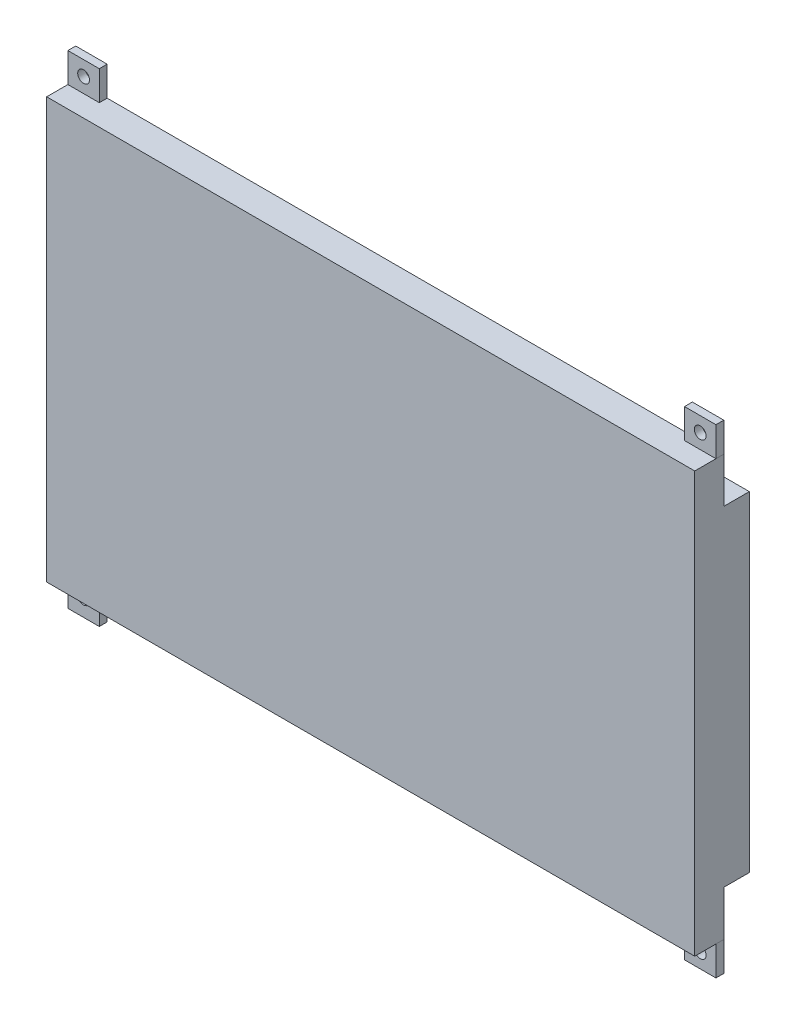
ISO-10303-21;
HEADER;
FILE_DESCRIPTION(('STEP AP214'),'2;1');
FILE_NAME('part.step','',(''),(''),'','','');
FILE_SCHEMA(('AUTOMOTIVE_DESIGN { 1 0 10303 214 1 1 1 1 }'));
ENDSEC;
DATA;
#1=APPLICATION_CONTEXT('core data for automotive mechanical design processes');
#2=APPLICATION_PROTOCOL_DEFINITION('international standard','automotive_design',2000,#1);
#3=PRODUCT_CONTEXT('',#1,'mechanical');
#4=PRODUCT('Part','Part','',(#3));
#5=PRODUCT_RELATED_PRODUCT_CATEGORY('part','',(#4));
#6=PRODUCT_DEFINITION_FORMATION('','',#4);
#7=PRODUCT_DEFINITION_CONTEXT('part definition',#1,'design');
#8=PRODUCT_DEFINITION('design','',#6,#7);
#9=PRODUCT_DEFINITION_SHAPE('','',#8);
#10=(LENGTH_UNIT() NAMED_UNIT(*) SI_UNIT(.MILLI.,.METRE.));
#11=(NAMED_UNIT(*) PLANE_ANGLE_UNIT() SI_UNIT($,.RADIAN.));
#12=(NAMED_UNIT(*) SI_UNIT($,.STERADIAN.) SOLID_ANGLE_UNIT());
#13=UNCERTAINTY_MEASURE_WITH_UNIT(LENGTH_MEASURE(1.E-05),#10,'distance_accuracy_value','');
#14=(GEOMETRIC_REPRESENTATION_CONTEXT(3) GLOBAL_UNCERTAINTY_ASSIGNED_CONTEXT((#13)) GLOBAL_UNIT_ASSIGNED_CONTEXT((#10,
#11,#12)) REPRESENTATION_CONTEXT('',''));
#15=CARTESIAN_POINT('',(0.,0.,0.));
#16=DIRECTION('',(0.,0.,1.));
#17=DIRECTION('',(1.,0.,0.));
#18=AXIS2_PLACEMENT_3D('',#15,#16,#17);
#19=CARTESIAN_POINT('',(82.5,-53.5,2.));
#20=DIRECTION('',(1.,0.,0.));
#21=DIRECTION('',(0.,0.,-1.));
#22=AXIS2_PLACEMENT_3D('',#19,#20,#21);
#23=PLANE('',#22);
#24=DIRECTION('',(0.,-1.,0.));
#25=VECTOR('',#24,1.);
#26=CARTESIAN_POINT('',(82.5,-53.5,0.));
#27=LINE('',#26,#25);
#28=CARTESIAN_POINT('',(82.5,-53.5,0.));
#29=VERTEX_POINT('',#28);
#30=CARTESIAN_POINT('',(82.5,-61.,0.));
#31=VERTEX_POINT('',#30);
#32=EDGE_CURVE('E109',#29,#31,#27,.T.);
#33=ORIENTED_EDGE('',*,*,#32,.F.);
#34=DIRECTION('',(0.,0.,-1.));
#35=VECTOR('',#34,1.);
#36=CARTESIAN_POINT('',(82.5,-53.5,2.));
#37=LINE('',#36,#35);
#38=CARTESIAN_POINT('',(82.5,-53.5,2.));
#39=VERTEX_POINT('',#38);
#40=EDGE_CURVE('E12',#39,#29,#37,.T.);
#41=ORIENTED_EDGE('',*,*,#40,.F.);
#42=DIRECTION('',(0.,-1.,0.));
#43=VECTOR('',#42,1.);
#44=CARTESIAN_POINT('',(82.5,-53.5,2.));
#45=LINE('',#44,#43);
#46=CARTESIAN_POINT('',(82.5,-61.,2.));
#47=VERTEX_POINT('',#46);
#48=EDGE_CURVE('E102',#39,#47,#45,.T.);
#49=ORIENTED_EDGE('',*,*,#48,.T.);
#50=DIRECTION('',(0.,0.,-1.));
#51=VECTOR('',#50,1.);
#52=CARTESIAN_POINT('',(82.5,-61.,2.));
#53=LINE('',#52,#51);
#54=EDGE_CURVE('E47',#47,#31,#53,.T.);
#55=ORIENTED_EDGE('',*,*,#54,.T.);
#56=EDGE_LOOP('',(#33,#41,#49,#55));
#57=FACE_BOUND('',#56,.T.);
#58=ADVANCED_FACE('F44',(#57),#23,.T.);
#59=CARTESIAN_POINT('',(82.5,-53.5,2.));
#60=DIRECTION('',(0.,1.,0.));
#61=DIRECTION('',(-1.,0.,0.));
#62=AXIS2_PLACEMENT_3D('',#59,#60,#61);
#63=PLANE('',#62);
#64=DIRECTION('',(1.,0.,0.));
#65=VECTOR('',#64,1.);
#66=CARTESIAN_POINT('',(82.5,-53.5,0.));
#67=LINE('',#66,#65);
#68=CARTESIAN_POINT('',(74.5,-53.5,0.));
#69=VERTEX_POINT('',#68);
#70=EDGE_CURVE('E104',#69,#29,#67,.T.);
#71=ORIENTED_EDGE('',*,*,#70,.F.);
#72=DIRECTION('',(0.,0.,-1.));
#73=VECTOR('',#72,1.);
#74=CARTESIAN_POINT('',(74.5,-53.5,2.));
#75=LINE('',#74,#73);
#76=CARTESIAN_POINT('',(74.5,-53.5,2.));
#77=VERTEX_POINT('',#76);
#78=EDGE_CURVE('E53',#77,#69,#75,.T.);
#79=ORIENTED_EDGE('',*,*,#78,.F.);
#80=DIRECTION('',(1.,0.,0.));
#81=VECTOR('',#80,1.);
#82=CARTESIAN_POINT('',(82.5,-53.5,2.));
#83=LINE('',#82,#81);
#84=EDGE_CURVE('E99',#77,#39,#83,.T.);
#85=ORIENTED_EDGE('',*,*,#84,.T.);
#86=ORIENTED_EDGE('',*,*,#40,.T.);
#87=EDGE_LOOP('',(#71,#79,#85,#86));
#88=FACE_BOUND('',#87,.T.);
#89=ADVANCED_FACE('F120',(#88),#63,.T.);
#90=CARTESIAN_POINT('',(74.5,-53.5,2.));
#91=DIRECTION('',(-1.,0.,0.));
#92=DIRECTION('',(0.,-1.,0.));
#93=AXIS2_PLACEMENT_3D('',#90,#91,#92);
#94=PLANE('',#93);
#95=DIRECTION('',(0.,1.,0.));
#96=VECTOR('',#95,1.);
#97=CARTESIAN_POINT('',(74.5,-53.5,0.));
#98=LINE('',#97,#96);
#99=CARTESIAN_POINT('',(74.5,-61.,0.));
#100=VERTEX_POINT('',#99);
#101=EDGE_CURVE('E94',#100,#69,#98,.T.);
#102=ORIENTED_EDGE('',*,*,#101,.F.);
#103=DIRECTION('',(0.,0.,-1.));
#104=VECTOR('',#103,1.);
#105=CARTESIAN_POINT('',(74.5,-61.,2.));
#106=LINE('',#105,#104);
#107=CARTESIAN_POINT('',(74.5,-61.,2.));
#108=VERTEX_POINT('',#107);
#109=EDGE_CURVE('E89',#108,#100,#106,.T.);
#110=ORIENTED_EDGE('',*,*,#109,.F.);
#111=DIRECTION('',(0.,1.,0.));
#112=VECTOR('',#111,1.);
#113=CARTESIAN_POINT('',(74.5,-53.5,2.));
#114=LINE('',#113,#112);
#115=EDGE_CURVE('E92',#108,#77,#114,.T.);
#116=ORIENTED_EDGE('',*,*,#115,.T.);
#117=ORIENTED_EDGE('',*,*,#78,.T.);
#118=EDGE_LOOP('',(#102,#110,#116,#117));
#119=FACE_BOUND('',#118,.T.);
#120=ADVANCED_FACE('F91',(#119),#94,.T.);
#121=CARTESIAN_POINT('',(82.5,-61.,2.));
#122=DIRECTION('',(0.,-1.,0.));
#123=DIRECTION('',(0.,0.,-1.));
#124=AXIS2_PLACEMENT_3D('',#121,#122,#123);
#125=PLANE('',#124);
#126=DIRECTION('',(-1.,0.,0.));
#127=VECTOR('',#126,1.);
#128=CARTESIAN_POINT('',(82.5,-61.,0.));
#129=LINE('',#128,#127);
#130=EDGE_CURVE('E112',#31,#100,#129,.T.);
#131=ORIENTED_EDGE('',*,*,#130,.F.);
#132=ORIENTED_EDGE('',*,*,#54,.F.);
#133=DIRECTION('',(-1.,0.,0.));
#134=VECTOR('',#133,1.);
#135=CARTESIAN_POINT('',(82.5,-61.,2.));
#136=LINE('',#135,#134);
#137=EDGE_CURVE('E98',#47,#108,#136,.T.);
#138=ORIENTED_EDGE('',*,*,#137,.T.);
#139=ORIENTED_EDGE('',*,*,#109,.T.);
#140=EDGE_LOOP('',(#131,#132,#138,#139));
#141=FACE_BOUND('',#140,.T.);
#142=ADVANCED_FACE('F101',(#141),#125,.T.);
#143=CARTESIAN_POINT('',(0.,0.,2.));
#144=DIRECTION('',(0.,0.,-1.));
#145=DIRECTION('',(-1.,0.,0.));
#146=AXIS2_PLACEMENT_3D('',#143,#144,#145);
#147=PLANE('',#146);
#148=CARTESIAN_POINT('',(78.5,-57.25,2.));
#149=DIRECTION('',(0.,0.,-1.));
#150=DIRECTION('',(-1.,0.,0.));
#151=AXIS2_PLACEMENT_3D('',#148,#149,#150);
#152=CIRCLE('',#151,1.5);
#153=CARTESIAN_POINT('',(77.,-57.25,2.));
#154=VERTEX_POINT('',#153);
#155=EDGE_CURVE('E113',#154,#154,#152,.T.);
#156=ORIENTED_EDGE('',*,*,#155,.T.);
#157=EDGE_LOOP('',(#156));
#158=FACE_BOUND('',#157,.T.);
#159=ORIENTED_EDGE('',*,*,#48,.F.);
#160=ORIENTED_EDGE('',*,*,#84,.F.);
#161=ORIENTED_EDGE('',*,*,#115,.F.);
#162=ORIENTED_EDGE('',*,*,#137,.F.);
#163=EDGE_LOOP('',(#159,#160,#161,#162));
#164=FACE_BOUND('',#163,.T.);
#165=ADVANCED_FACE('F97',(#158,#164),#147,.F.);
#166=CARTESIAN_POINT('',(0.,0.,0.));
#167=DIRECTION('',(0.,0.,-1.));
#168=DIRECTION('',(-1.,0.,0.));
#169=AXIS2_PLACEMENT_3D('',#166,#167,#168);
#170=PLANE('',#169);
#171=CARTESIAN_POINT('',(78.5,-57.25,0.));
#172=DIRECTION('',(0.,0.,-1.));
#173=DIRECTION('',(-1.,0.,0.));
#174=AXIS2_PLACEMENT_3D('',#171,#172,#173);
#175=CIRCLE('',#174,1.5);
#176=CARTESIAN_POINT('',(77.,-57.25,0.));
#177=VERTEX_POINT('',#176);
#178=EDGE_CURVE('E150',#177,#177,#175,.T.);
#179=ORIENTED_EDGE('',*,*,#178,.F.);
#180=EDGE_LOOP('',(#179));
#181=FACE_BOUND('',#180,.T.);
#182=ORIENTED_EDGE('',*,*,#32,.T.);
#183=ORIENTED_EDGE('',*,*,#130,.T.);
#184=ORIENTED_EDGE('',*,*,#101,.T.);
#185=ORIENTED_EDGE('',*,*,#70,.T.);
#186=EDGE_LOOP('',(#182,#183,#184,#185));
#187=FACE_BOUND('',#186,.T.);
#188=ADVANCED_FACE('F119',(#181,#187),#170,.T.);
#189=CARTESIAN_POINT('',(78.5,-57.25,2.));
#190=DIRECTION('',(0.,0.,-1.));
#191=DIRECTION('',(-1.,0.,0.));
#192=AXIS2_PLACEMENT_3D('',#189,#190,#191);
#193=CYLINDRICAL_SURFACE('',#192,1.5);
#194=ORIENTED_EDGE('',*,*,#155,.F.);
#195=EDGE_LOOP('',(#194));
#196=FACE_BOUND('',#195,.T.);
#197=ORIENTED_EDGE('',*,*,#178,.T.);
#198=EDGE_LOOP('',(#197));
#199=FACE_BOUND('',#198,.T.);
#200=ADVANCED_FACE('F138',(#196,#199),#193,.F.);
#201=CLOSED_SHELL('',(#58,#89,#120,#142,#165,#188,#200));
#202=MANIFOLD_SOLID_BREP('B2',#201);
#203=CARTESIAN_POINT('',(-82.5,-53.5,2.));
#204=DIRECTION('',(-1.,0.,0.));
#205=DIRECTION('',(0.,0.,1.));
#206=AXIS2_PLACEMENT_3D('',#203,#204,#205);
#207=PLANE('',#206);
#208=DIRECTION('',(0.,1.,0.));
#209=VECTOR('',#208,1.);
#210=CARTESIAN_POINT('',(-82.5,-53.5,0.));
#211=LINE('',#210,#209);
#212=CARTESIAN_POINT('',(-82.5,-62.,0.));
#213=VERTEX_POINT('',#212);
#214=CARTESIAN_POINT('',(-82.5,-53.5,0.));
#215=VERTEX_POINT('',#214);
#216=EDGE_CURVE('E264',#213,#215,#211,.T.);
#217=ORIENTED_EDGE('',*,*,#216,.F.);
#218=DIRECTION('',(0.,0.,-1.));
#219=VECTOR('',#218,1.);
#220=CARTESIAN_POINT('',(-82.5,-62.,2.));
#221=LINE('',#220,#219);
#222=CARTESIAN_POINT('',(-82.5,-62.,2.));
#223=VERTEX_POINT('',#222);
#224=EDGE_CURVE('E42',#223,#213,#221,.T.);
#225=ORIENTED_EDGE('',*,*,#224,.F.);
#226=DIRECTION('',(0.,1.,0.));
#227=VECTOR('',#226,1.);
#228=CARTESIAN_POINT('',(-82.5,-53.5,2.));
#229=LINE('',#228,#227);
#230=CARTESIAN_POINT('',(-82.5,-53.5,2.));
#231=VERTEX_POINT('',#230);
#232=EDGE_CURVE('E257',#223,#231,#229,.T.);
#233=ORIENTED_EDGE('',*,*,#232,.T.);
#234=DIRECTION('',(0.,0.,-1.));
#235=VECTOR('',#234,1.);
#236=CARTESIAN_POINT('',(-82.5,-53.5,2.));
#237=LINE('',#236,#235);
#238=EDGE_CURVE('E202',#231,#215,#237,.T.);
#239=ORIENTED_EDGE('',*,*,#238,.T.);
#240=EDGE_LOOP('',(#217,#225,#233,#239));
#241=FACE_BOUND('',#240,.T.);
#242=ADVANCED_FACE('F199',(#241),#207,.T.);
#243=CARTESIAN_POINT('',(-82.5,-62.,2.));
#244=DIRECTION('',(0.,-1.,0.));
#245=DIRECTION('',(0.,0.,-1.));
#246=AXIS2_PLACEMENT_3D('',#243,#244,#245);
#247=PLANE('',#246);
#248=DIRECTION('',(-1.,0.,0.));
#249=VECTOR('',#248,1.);
#250=CARTESIAN_POINT('',(-82.5,-62.,0.));
#251=LINE('',#250,#249);
#252=CARTESIAN_POINT('',(-74.5,-62.,0.));
#253=VERTEX_POINT('',#252);
#254=EDGE_CURVE('E259',#253,#213,#251,.T.);
#255=ORIENTED_EDGE('',*,*,#254,.F.);
#256=DIRECTION('',(0.,0.,-1.));
#257=VECTOR('',#256,1.);
#258=CARTESIAN_POINT('',(-74.5,-62.,2.));
#259=LINE('',#258,#257);
#260=CARTESIAN_POINT('',(-74.5,-62.,2.));
#261=VERTEX_POINT('',#260);
#262=EDGE_CURVE('E208',#261,#253,#259,.T.);
#263=ORIENTED_EDGE('',*,*,#262,.F.);
#264=DIRECTION('',(-1.,0.,0.));
#265=VECTOR('',#264,1.);
#266=CARTESIAN_POINT('',(-82.5,-62.,2.));
#267=LINE('',#266,#265);
#268=EDGE_CURVE('E254',#261,#223,#267,.T.);
#269=ORIENTED_EDGE('',*,*,#268,.T.);
#270=ORIENTED_EDGE('',*,*,#224,.T.);
#271=EDGE_LOOP('',(#255,#263,#269,#270));
#272=FACE_BOUND('',#271,.T.);
#273=ADVANCED_FACE('F275',(#272),#247,.T.);
#274=CARTESIAN_POINT('',(-74.5,-53.5,2.));
#275=DIRECTION('',(1.,0.,0.));
#276=DIRECTION('',(0.,0.,-1.));
#277=AXIS2_PLACEMENT_3D('',#274,#275,#276);
#278=PLANE('',#277);
#279=DIRECTION('',(0.,-1.,0.));
#280=VECTOR('',#279,1.);
#281=CARTESIAN_POINT('',(-74.5,-53.5,0.));
#282=LINE('',#281,#280);
#283=CARTESIAN_POINT('',(-74.5,-53.5,0.));
#284=VERTEX_POINT('',#283);
#285=EDGE_CURVE('E249',#284,#253,#282,.T.);
#286=ORIENTED_EDGE('',*,*,#285,.F.);
#287=DIRECTION('',(0.,0.,-1.));
#288=VECTOR('',#287,1.);
#289=CARTESIAN_POINT('',(-74.5,-53.5,2.));
#290=LINE('',#289,#288);
#291=CARTESIAN_POINT('',(-74.5,-53.5,2.));
#292=VERTEX_POINT('',#291);
#293=EDGE_CURVE('E244',#292,#284,#290,.T.);
#294=ORIENTED_EDGE('',*,*,#293,.F.);
#295=DIRECTION('',(0.,-1.,0.));
#296=VECTOR('',#295,1.);
#297=CARTESIAN_POINT('',(-74.5,-53.5,2.));
#298=LINE('',#297,#296);
#299=EDGE_CURVE('E247',#292,#261,#298,.T.);
#300=ORIENTED_EDGE('',*,*,#299,.T.);
#301=ORIENTED_EDGE('',*,*,#262,.T.);
#302=EDGE_LOOP('',(#286,#294,#300,#301));
#303=FACE_BOUND('',#302,.T.);
#304=ADVANCED_FACE('F246',(#303),#278,.T.);
#305=CARTESIAN_POINT('',(-82.5,-53.5,2.));
#306=DIRECTION('',(0.,1.,0.));
#307=DIRECTION('',(0.,0.,1.));
#308=AXIS2_PLACEMENT_3D('',#305,#306,#307);
#309=PLANE('',#308);
#310=DIRECTION('',(1.,0.,0.));
#311=VECTOR('',#310,1.);
#312=CARTESIAN_POINT('',(-82.5,-53.5,0.));
#313=LINE('',#312,#311);
#314=EDGE_CURVE('E267',#215,#284,#313,.T.);
#315=ORIENTED_EDGE('',*,*,#314,.F.);
#316=ORIENTED_EDGE('',*,*,#238,.F.);
#317=DIRECTION('',(1.,0.,0.));
#318=VECTOR('',#317,1.);
#319=CARTESIAN_POINT('',(-82.5,-53.5,2.));
#320=LINE('',#319,#318);
#321=EDGE_CURVE('E253',#231,#292,#320,.T.);
#322=ORIENTED_EDGE('',*,*,#321,.T.);
#323=ORIENTED_EDGE('',*,*,#293,.T.);
#324=EDGE_LOOP('',(#315,#316,#322,#323));
#325=FACE_BOUND('',#324,.T.);
#326=ADVANCED_FACE('F256',(#325),#309,.T.);
#327=CARTESIAN_POINT('',(0.,0.,2.));
#328=DIRECTION('',(0.,0.,1.));
#329=DIRECTION('',(1.,0.,0.));
#330=AXIS2_PLACEMENT_3D('',#327,#328,#329);
#331=PLANE('',#330);
#332=CARTESIAN_POINT('',(-78.5,-57.75,2.));
#333=DIRECTION('',(0.,0.,-1.));
#334=DIRECTION('',(-1.,0.,0.));
#335=AXIS2_PLACEMENT_3D('',#332,#333,#334);
#336=CIRCLE('',#335,1.5);
#337=CARTESIAN_POINT('',(-80.,-57.75,2.));
#338=VERTEX_POINT('',#337);
#339=EDGE_CURVE('E268',#338,#338,#336,.T.);
#340=ORIENTED_EDGE('',*,*,#339,.T.);
#341=EDGE_LOOP('',(#340));
#342=FACE_BOUND('',#341,.T.);
#343=ORIENTED_EDGE('',*,*,#232,.F.);
#344=ORIENTED_EDGE('',*,*,#268,.F.);
#345=ORIENTED_EDGE('',*,*,#299,.F.);
#346=ORIENTED_EDGE('',*,*,#321,.F.);
#347=EDGE_LOOP('',(#343,#344,#345,#346));
#348=FACE_BOUND('',#347,.T.);
#349=ADVANCED_FACE('F252',(#342,#348),#331,.T.);
#350=CARTESIAN_POINT('',(0.,0.,0.));
#351=DIRECTION('',(0.,0.,1.));
#352=DIRECTION('',(1.,0.,0.));
#353=AXIS2_PLACEMENT_3D('',#350,#351,#352);
#354=PLANE('',#353);
#355=CARTESIAN_POINT('',(-78.5,-57.75,0.));
#356=DIRECTION('',(0.,0.,-1.));
#357=DIRECTION('',(-1.,0.,0.));
#358=AXIS2_PLACEMENT_3D('',#355,#356,#357);
#359=CIRCLE('',#358,1.5);
#360=CARTESIAN_POINT('',(-80.,-57.75,0.));
#361=VERTEX_POINT('',#360);
#362=EDGE_CURVE('E305',#361,#361,#359,.T.);
#363=ORIENTED_EDGE('',*,*,#362,.F.);
#364=EDGE_LOOP('',(#363));
#365=FACE_BOUND('',#364,.T.);
#366=ORIENTED_EDGE('',*,*,#216,.T.);
#367=ORIENTED_EDGE('',*,*,#314,.T.);
#368=ORIENTED_EDGE('',*,*,#285,.T.);
#369=ORIENTED_EDGE('',*,*,#254,.T.);
#370=EDGE_LOOP('',(#366,#367,#368,#369));
#371=FACE_BOUND('',#370,.T.);
#372=ADVANCED_FACE('F274',(#365,#371),#354,.F.);
#373=CARTESIAN_POINT('',(-78.5,-57.75,2.));
#374=DIRECTION('',(0.,0.,-1.));
#375=DIRECTION('',(-1.,0.,0.));
#376=AXIS2_PLACEMENT_3D('',#373,#374,#375);
#377=CYLINDRICAL_SURFACE('',#376,1.5);
#378=ORIENTED_EDGE('',*,*,#339,.F.);
#379=EDGE_LOOP('',(#378));
#380=FACE_BOUND('',#379,.T.);
#381=ORIENTED_EDGE('',*,*,#362,.T.);
#382=EDGE_LOOP('',(#381));
#383=FACE_BOUND('',#382,.T.);
#384=ADVANCED_FACE('F293',(#380,#383),#377,.F.);
#385=CLOSED_SHELL('',(#242,#273,#304,#326,#349,#372,#384));
#386=MANIFOLD_SOLID_BREP('B6',#385);
#387=CARTESIAN_POINT('',(-82.5,53.5,2.));
#388=DIRECTION('',(-1.,0.,0.));
#389=DIRECTION('',(0.,0.,1.));
#390=AXIS2_PLACEMENT_3D('',#387,#388,#389);
#391=PLANE('',#390);
#392=DIRECTION('',(0.,1.,0.));
#393=VECTOR('',#392,1.);
#394=CARTESIAN_POINT('',(-82.5,53.5,0.));
#395=LINE('',#394,#393);
#396=CARTESIAN_POINT('',(-82.5,53.5,0.));
#397=VERTEX_POINT('',#396);
#398=CARTESIAN_POINT('',(-82.5,61.,0.));
#399=VERTEX_POINT('',#398);
#400=EDGE_CURVE('E419',#397,#399,#395,.T.);
#401=ORIENTED_EDGE('',*,*,#400,.F.);
#402=DIRECTION('',(0.,0.,-1.));
#403=VECTOR('',#402,1.);
#404=CARTESIAN_POINT('',(-82.5,53.5,2.));
#405=LINE('',#404,#403);
#406=CARTESIAN_POINT('',(-82.5,53.5,2.));
#407=VERTEX_POINT('',#406);
#408=EDGE_CURVE('E197',#407,#397,#405,.T.);
#409=ORIENTED_EDGE('',*,*,#408,.F.);
#410=DIRECTION('',(0.,1.,0.));
#411=VECTOR('',#410,1.);
#412=CARTESIAN_POINT('',(-82.5,53.5,2.));
#413=LINE('',#412,#411);
#414=CARTESIAN_POINT('',(-82.5,61.,2.));
#415=VERTEX_POINT('',#414);
#416=EDGE_CURVE('E412',#407,#415,#413,.T.);
#417=ORIENTED_EDGE('',*,*,#416,.T.);
#418=DIRECTION('',(0.,0.,-1.));
#419=VECTOR('',#418,1.);
#420=CARTESIAN_POINT('',(-82.5,61.,2.));
#421=LINE('',#420,#419);
#422=EDGE_CURVE('E357',#415,#399,#421,.T.);
#423=ORIENTED_EDGE('',*,*,#422,.T.);
#424=EDGE_LOOP('',(#401,#409,#417,#423));
#425=FACE_BOUND('',#424,.T.);
#426=ADVANCED_FACE('F354',(#425),#391,.T.);
#427=CARTESIAN_POINT('',(-82.5,53.5,2.));
#428=DIRECTION('',(0.,-1.,0.));
#429=DIRECTION('',(0.,0.,-1.));
#430=AXIS2_PLACEMENT_3D('',#427,#428,#429);
#431=PLANE('',#430);
#432=DIRECTION('',(-1.,0.,0.));
#433=VECTOR('',#432,1.);
#434=CARTESIAN_POINT('',(-82.5,53.5,0.));
#435=LINE('',#434,#433);
#436=CARTESIAN_POINT('',(-74.5,53.5,0.));
#437=VERTEX_POINT('',#436);
#438=EDGE_CURVE('E414',#437,#397,#435,.T.);
#439=ORIENTED_EDGE('',*,*,#438,.F.);
#440=DIRECTION('',(0.,0.,-1.));
#441=VECTOR('',#440,1.);
#442=CARTESIAN_POINT('',(-74.5,53.5,2.));
#443=LINE('',#442,#441);
#444=CARTESIAN_POINT('',(-74.5,53.5,2.));
#445=VERTEX_POINT('',#444);
#446=EDGE_CURVE('E363',#445,#437,#443,.T.);
#447=ORIENTED_EDGE('',*,*,#446,.F.);
#448=DIRECTION('',(-1.,0.,0.));
#449=VECTOR('',#448,1.);
#450=CARTESIAN_POINT('',(-82.5,53.5,2.));
#451=LINE('',#450,#449);
#452=EDGE_CURVE('E409',#445,#407,#451,.T.);
#453=ORIENTED_EDGE('',*,*,#452,.T.);
#454=ORIENTED_EDGE('',*,*,#408,.T.);
#455=EDGE_LOOP('',(#439,#447,#453,#454));
#456=FACE_BOUND('',#455,.T.);
#457=ADVANCED_FACE('F430',(#456),#431,.T.);
#458=CARTESIAN_POINT('',(-74.5,53.5,2.));
#459=DIRECTION('',(1.,0.,0.));
#460=DIRECTION('',(0.,0.,-1.));
#461=AXIS2_PLACEMENT_3D('',#458,#459,#460);
#462=PLANE('',#461);
#463=DIRECTION('',(0.,-1.,0.));
#464=VECTOR('',#463,1.);
#465=CARTESIAN_POINT('',(-74.5,53.5,0.));
#466=LINE('',#465,#464);
#467=CARTESIAN_POINT('',(-74.5,61.,0.));
#468=VERTEX_POINT('',#467);
#469=EDGE_CURVE('E404',#468,#437,#466,.T.);
#470=ORIENTED_EDGE('',*,*,#469,.F.);
#471=DIRECTION('',(0.,0.,-1.));
#472=VECTOR('',#471,1.);
#473=CARTESIAN_POINT('',(-74.5,61.,2.));
#474=LINE('',#473,#472);
#475=CARTESIAN_POINT('',(-74.5,61.,2.));
#476=VERTEX_POINT('',#475);
#477=EDGE_CURVE('E399',#476,#468,#474,.T.);
#478=ORIENTED_EDGE('',*,*,#477,.F.);
#479=DIRECTION('',(0.,-1.,0.));
#480=VECTOR('',#479,1.);
#481=CARTESIAN_POINT('',(-74.5,53.5,2.));
#482=LINE('',#481,#480);
#483=EDGE_CURVE('E402',#476,#445,#482,.T.);
#484=ORIENTED_EDGE('',*,*,#483,.T.);
#485=ORIENTED_EDGE('',*,*,#446,.T.);
#486=EDGE_LOOP('',(#470,#478,#484,#485));
#487=FACE_BOUND('',#486,.T.);
#488=ADVANCED_FACE('F401',(#487),#462,.T.);
#489=CARTESIAN_POINT('',(-82.5,61.,2.));
#490=DIRECTION('',(0.,1.,0.));
#491=DIRECTION('',(0.,0.,1.));
#492=AXIS2_PLACEMENT_3D('',#489,#490,#491);
#493=PLANE('',#492);
#494=DIRECTION('',(1.,0.,0.));
#495=VECTOR('',#494,1.);
#496=CARTESIAN_POINT('',(-82.5,61.,0.));
#497=LINE('',#496,#495);
#498=EDGE_CURVE('E422',#399,#468,#497,.T.);
#499=ORIENTED_EDGE('',*,*,#498,.F.);
#500=ORIENTED_EDGE('',*,*,#422,.F.);
#501=DIRECTION('',(1.,0.,0.));
#502=VECTOR('',#501,1.);
#503=CARTESIAN_POINT('',(-82.5,61.,2.));
#504=LINE('',#503,#502);
#505=EDGE_CURVE('E408',#415,#476,#504,.T.);
#506=ORIENTED_EDGE('',*,*,#505,.T.);
#507=ORIENTED_EDGE('',*,*,#477,.T.);
#508=EDGE_LOOP('',(#499,#500,#506,#507));
#509=FACE_BOUND('',#508,.T.);
#510=ADVANCED_FACE('F411',(#509),#493,.T.);
#511=CARTESIAN_POINT('',(0.,0.,2.));
#512=DIRECTION('',(0.,0.,-1.));
#513=DIRECTION('',(-1.,0.,0.));
#514=AXIS2_PLACEMENT_3D('',#511,#512,#513);
#515=PLANE('',#514);
#516=CARTESIAN_POINT('',(-78.5,57.25,2.));
#517=DIRECTION('',(0.,0.,-1.));
#518=DIRECTION('',(-1.,0.,0.));
#519=AXIS2_PLACEMENT_3D('',#516,#517,#518);
#520=CIRCLE('',#519,1.50000000000001);
#521=CARTESIAN_POINT('',(-80.,57.25,2.));
#522=VERTEX_POINT('',#521);
#523=EDGE_CURVE('E423',#522,#522,#520,.T.);
#524=ORIENTED_EDGE('',*,*,#523,.T.);
#525=EDGE_LOOP('',(#524));
#526=FACE_BOUND('',#525,.T.);
#527=ORIENTED_EDGE('',*,*,#416,.F.);
#528=ORIENTED_EDGE('',*,*,#452,.F.);
#529=ORIENTED_EDGE('',*,*,#483,.F.);
#530=ORIENTED_EDGE('',*,*,#505,.F.);
#531=EDGE_LOOP('',(#527,#528,#529,#530));
#532=FACE_BOUND('',#531,.T.);
#533=ADVANCED_FACE('F407',(#526,#532),#515,.F.);
#534=CARTESIAN_POINT('',(0.,0.,0.));
#535=DIRECTION('',(0.,0.,-1.));
#536=DIRECTION('',(-1.,0.,0.));
#537=AXIS2_PLACEMENT_3D('',#534,#535,#536);
#538=PLANE('',#537);
#539=CARTESIAN_POINT('',(-78.5,57.25,0.));
#540=DIRECTION('',(0.,0.,-1.));
#541=DIRECTION('',(-1.,0.,0.));
#542=AXIS2_PLACEMENT_3D('',#539,#540,#541);
#543=CIRCLE('',#542,1.50000000000001);
#544=CARTESIAN_POINT('',(-80.,57.25,0.));
#545=VERTEX_POINT('',#544);
#546=EDGE_CURVE('E460',#545,#545,#543,.T.);
#547=ORIENTED_EDGE('',*,*,#546,.F.);
#548=EDGE_LOOP('',(#547));
#549=FACE_BOUND('',#548,.T.);
#550=ORIENTED_EDGE('',*,*,#400,.T.);
#551=ORIENTED_EDGE('',*,*,#498,.T.);
#552=ORIENTED_EDGE('',*,*,#469,.T.);
#553=ORIENTED_EDGE('',*,*,#438,.T.);
#554=EDGE_LOOP('',(#550,#551,#552,#553));
#555=FACE_BOUND('',#554,.T.);
#556=ADVANCED_FACE('F429',(#549,#555),#538,.T.);
#557=CARTESIAN_POINT('',(-78.5,57.25,2.));
#558=DIRECTION('',(0.,0.,-1.));
#559=DIRECTION('',(-1.,0.,0.));
#560=AXIS2_PLACEMENT_3D('',#557,#558,#559);
#561=CYLINDRICAL_SURFACE('',#560,1.50000000000001);
#562=ORIENTED_EDGE('',*,*,#523,.F.);
#563=EDGE_LOOP('',(#562));
#564=FACE_BOUND('',#563,.T.);
#565=ORIENTED_EDGE('',*,*,#546,.T.);
#566=EDGE_LOOP('',(#565));
#567=FACE_BOUND('',#566,.T.);
#568=ADVANCED_FACE('F448',(#564,#567),#561,.F.);
#569=CLOSED_SHELL('',(#426,#457,#488,#510,#533,#556,#568));
#570=MANIFOLD_SOLID_BREP('B36',#569);
#571=CARTESIAN_POINT('',(82.5,53.5,2.));
#572=DIRECTION('',(1.,0.,0.));
#573=DIRECTION('',(0.,0.,-1.));
#574=AXIS2_PLACEMENT_3D('',#571,#572,#573);
#575=PLANE('',#574);
#576=DIRECTION('',(0.,-1.,0.));
#577=VECTOR('',#576,1.);
#578=CARTESIAN_POINT('',(82.5,53.5,0.));
#579=LINE('',#578,#577);
#580=CARTESIAN_POINT('',(82.5,61.,0.));
#581=VERTEX_POINT('',#580);
#582=CARTESIAN_POINT('',(82.5,53.5,0.));
#583=VERTEX_POINT('',#582);
#584=EDGE_CURVE('E573',#581,#583,#579,.T.);
#585=ORIENTED_EDGE('',*,*,#584,.F.);
#586=DIRECTION('',(0.,0.,-1.));
#587=VECTOR('',#586,1.);
#588=CARTESIAN_POINT('',(82.5,61.,2.));
#589=LINE('',#588,#587);
#590=CARTESIAN_POINT('',(82.5,61.,2.));
#591=VERTEX_POINT('',#590);
#592=EDGE_CURVE('E352',#591,#581,#589,.T.);
#593=ORIENTED_EDGE('',*,*,#592,.F.);
#594=DIRECTION('',(0.,-1.,0.));
#595=VECTOR('',#594,1.);
#596=CARTESIAN_POINT('',(82.5,53.5,2.));
#597=LINE('',#596,#595);
#598=CARTESIAN_POINT('',(82.5,53.5,2.));
#599=VERTEX_POINT('',#598);
#600=EDGE_CURVE('E566',#591,#599,#597,.T.);
#601=ORIENTED_EDGE('',*,*,#600,.T.);
#602=DIRECTION('',(0.,0.,-1.));
#603=VECTOR('',#602,1.);
#604=CARTESIAN_POINT('',(82.5,53.5,2.));
#605=LINE('',#604,#603);
#606=EDGE_CURVE('E511',#599,#583,#605,.T.);
#607=ORIENTED_EDGE('',*,*,#606,.T.);
#608=EDGE_LOOP('',(#585,#593,#601,#607));
#609=FACE_BOUND('',#608,.T.);
#610=ADVANCED_FACE('F508',(#609),#575,.T.);
#611=CARTESIAN_POINT('',(82.5,61.,2.));
#612=DIRECTION('',(0.,1.,0.));
#613=DIRECTION('',(0.,0.,1.));
#614=AXIS2_PLACEMENT_3D('',#611,#612,#613);
#615=PLANE('',#614);
#616=DIRECTION('',(1.,0.,0.));
#617=VECTOR('',#616,1.);
#618=CARTESIAN_POINT('',(82.5,61.,0.));
#619=LINE('',#618,#617);
#620=CARTESIAN_POINT('',(74.5,61.,0.));
#621=VERTEX_POINT('',#620);
#622=EDGE_CURVE('E568',#621,#581,#619,.T.);
#623=ORIENTED_EDGE('',*,*,#622,.F.);
#624=DIRECTION('',(0.,0.,-1.));
#625=VECTOR('',#624,1.);
#626=CARTESIAN_POINT('',(74.5,61.,2.));
#627=LINE('',#626,#625);
#628=CARTESIAN_POINT('',(74.5,61.,2.));
#629=VERTEX_POINT('',#628);
#630=EDGE_CURVE('E517',#629,#621,#627,.T.);
#631=ORIENTED_EDGE('',*,*,#630,.F.);
#632=DIRECTION('',(1.,0.,0.));
#633=VECTOR('',#632,1.);
#634=CARTESIAN_POINT('',(82.5,61.,2.));
#635=LINE('',#634,#633);
#636=EDGE_CURVE('E563',#629,#591,#635,.T.);
#637=ORIENTED_EDGE('',*,*,#636,.T.);
#638=ORIENTED_EDGE('',*,*,#592,.T.);
#639=EDGE_LOOP('',(#623,#631,#637,#638));
#640=FACE_BOUND('',#639,.T.);
#641=ADVANCED_FACE('F584',(#640),#615,.T.);
#642=CARTESIAN_POINT('',(74.5,53.5,2.));
#643=DIRECTION('',(-1.,0.,0.));
#644=DIRECTION('',(0.,-1.,0.));
#645=AXIS2_PLACEMENT_3D('',#642,#643,#644);
#646=PLANE('',#645);
#647=DIRECTION('',(0.,1.,0.));
#648=VECTOR('',#647,1.);
#649=CARTESIAN_POINT('',(74.5,53.5,0.));
#650=LINE('',#649,#648);
#651=CARTESIAN_POINT('',(74.5,53.5,0.));
#652=VERTEX_POINT('',#651);
#653=EDGE_CURVE('E558',#652,#621,#650,.T.);
#654=ORIENTED_EDGE('',*,*,#653,.F.);
#655=DIRECTION('',(0.,0.,-1.));
#656=VECTOR('',#655,1.);
#657=CARTESIAN_POINT('',(74.5,53.5,2.));
#658=LINE('',#657,#656);
#659=CARTESIAN_POINT('',(74.5,53.5,2.));
#660=VERTEX_POINT('',#659);
#661=EDGE_CURVE('E553',#660,#652,#658,.T.);
#662=ORIENTED_EDGE('',*,*,#661,.F.);
#663=DIRECTION('',(0.,1.,0.));
#664=VECTOR('',#663,1.);
#665=CARTESIAN_POINT('',(74.5,53.5,2.));
#666=LINE('',#665,#664);
#667=EDGE_CURVE('E556',#660,#629,#666,.T.);
#668=ORIENTED_EDGE('',*,*,#667,.T.);
#669=ORIENTED_EDGE('',*,*,#630,.T.);
#670=EDGE_LOOP('',(#654,#662,#668,#669));
#671=FACE_BOUND('',#670,.T.);
#672=ADVANCED_FACE('F555',(#671),#646,.T.);
#673=CARTESIAN_POINT('',(82.5,53.5,2.));
#674=DIRECTION('',(0.,-1.,0.));
#675=DIRECTION('',(0.,0.,-1.));
#676=AXIS2_PLACEMENT_3D('',#673,#674,#675);
#677=PLANE('',#676);
#678=DIRECTION('',(-1.,0.,0.));
#679=VECTOR('',#678,1.);
#680=CARTESIAN_POINT('',(82.5,53.5,0.));
#681=LINE('',#680,#679);
#682=EDGE_CURVE('E576',#583,#652,#681,.T.);
#683=ORIENTED_EDGE('',*,*,#682,.F.);
#684=ORIENTED_EDGE('',*,*,#606,.F.);
#685=DIRECTION('',(-1.,0.,0.));
#686=VECTOR('',#685,1.);
#687=CARTESIAN_POINT('',(82.5,53.5,2.));
#688=LINE('',#687,#686);
#689=EDGE_CURVE('E562',#599,#660,#688,.T.);
#690=ORIENTED_EDGE('',*,*,#689,.T.);
#691=ORIENTED_EDGE('',*,*,#661,.T.);
#692=EDGE_LOOP('',(#683,#684,#690,#691));
#693=FACE_BOUND('',#692,.T.);
#694=ADVANCED_FACE('F565',(#693),#677,.T.);
#695=CARTESIAN_POINT('',(0.,0.,2.));
#696=DIRECTION('',(0.,0.,1.));
#697=DIRECTION('',(1.,0.,0.));
#698=AXIS2_PLACEMENT_3D('',#695,#696,#697);
#699=PLANE('',#698);
#700=CARTESIAN_POINT('',(78.5,57.25,2.));
#701=DIRECTION('',(0.,0.,-1.));
#702=DIRECTION('',(-1.,0.,0.));
#703=AXIS2_PLACEMENT_3D('',#700,#701,#702);
#704=CIRCLE('',#703,1.50000000000001);
#705=CARTESIAN_POINT('',(77.,57.25,2.));
#706=VERTEX_POINT('',#705);
#707=EDGE_CURVE('E577',#706,#706,#704,.T.);
#708=ORIENTED_EDGE('',*,*,#707,.T.);
#709=EDGE_LOOP('',(#708));
#710=FACE_BOUND('',#709,.T.);
#711=ORIENTED_EDGE('',*,*,#600,.F.);
#712=ORIENTED_EDGE('',*,*,#636,.F.);
#713=ORIENTED_EDGE('',*,*,#667,.F.);
#714=ORIENTED_EDGE('',*,*,#689,.F.);
#715=EDGE_LOOP('',(#711,#712,#713,#714));
#716=FACE_BOUND('',#715,.T.);
#717=ADVANCED_FACE('F561',(#710,#716),#699,.T.);
#718=CARTESIAN_POINT('',(0.,0.,0.));
#719=DIRECTION('',(0.,0.,1.));
#720=DIRECTION('',(1.,0.,0.));
#721=AXIS2_PLACEMENT_3D('',#718,#719,#720);
#722=PLANE('',#721);
#723=CARTESIAN_POINT('',(78.5,57.25,0.));
#724=DIRECTION('',(0.,0.,-1.));
#725=DIRECTION('',(-1.,0.,0.));
#726=AXIS2_PLACEMENT_3D('',#723,#724,#725);
#727=CIRCLE('',#726,1.50000000000001);
#728=CARTESIAN_POINT('',(77.,57.25,0.));
#729=VERTEX_POINT('',#728);
#730=EDGE_CURVE('E614',#729,#729,#727,.T.);
#731=ORIENTED_EDGE('',*,*,#730,.F.);
#732=EDGE_LOOP('',(#731));
#733=FACE_BOUND('',#732,.T.);
#734=ORIENTED_EDGE('',*,*,#584,.T.);
#735=ORIENTED_EDGE('',*,*,#682,.T.);
#736=ORIENTED_EDGE('',*,*,#653,.T.);
#737=ORIENTED_EDGE('',*,*,#622,.T.);
#738=EDGE_LOOP('',(#734,#735,#736,#737));
#739=FACE_BOUND('',#738,.T.);
#740=ADVANCED_FACE('F583',(#733,#739),#722,.F.);
#741=CARTESIAN_POINT('',(78.5,57.25,2.));
#742=DIRECTION('',(0.,0.,-1.));
#743=DIRECTION('',(-1.,0.,0.));
#744=AXIS2_PLACEMENT_3D('',#741,#742,#743);
#745=CYLINDRICAL_SURFACE('',#744,1.50000000000001);
#746=ORIENTED_EDGE('',*,*,#707,.F.);
#747=EDGE_LOOP('',(#746));
#748=FACE_BOUND('',#747,.T.);
#749=ORIENTED_EDGE('',*,*,#730,.T.);
#750=EDGE_LOOP('',(#749));
#751=FACE_BOUND('',#750,.T.);
#752=ADVANCED_FACE('F602',(#748,#751),#745,.F.);
#753=CLOSED_SHELL('',(#610,#641,#672,#694,#717,#740,#752));
#754=MANIFOLD_SOLID_BREP('B191',#753);
#755=CARTESIAN_POINT('',(0.,0.,0.));
#756=DIRECTION('',(0.,0.,1.));
#757=DIRECTION('',(1.,0.,0.));
#758=AXIS2_PLACEMENT_3D('',#755,#756,#757);
#759=PLANE('',#758);
#760=DIRECTION('',(1.,0.,0.));
#761=VECTOR('',#760,1.);
#762=CARTESIAN_POINT('',(82.5,42.,0.));
#763=LINE('',#762,#761);
#764=CARTESIAN_POINT('',(-82.5,42.,0.));
#765=VERTEX_POINT('',#764);
#766=CARTESIAN_POINT('',(82.5,42.,0.));
#767=VERTEX_POINT('',#766);
#768=EDGE_CURVE('E668',#765,#767,#763,.T.);
#769=ORIENTED_EDGE('',*,*,#768,.F.);
#770=DIRECTION('',(0.,-1.,0.));
#771=VECTOR('',#770,1.);
#772=CARTESIAN_POINT('',(-82.5,53.5,0.));
#773=LINE('',#772,#771);
#774=CARTESIAN_POINT('',(-82.5,53.5,0.));
#775=VERTEX_POINT('',#774);
#776=EDGE_CURVE('E762',#775,#765,#773,.T.);
#777=ORIENTED_EDGE('',*,*,#776,.F.);
#778=DIRECTION('',(-1.,0.,0.));
#779=VECTOR('',#778,1.);
#780=CARTESIAN_POINT('',(-82.5,53.5,0.));
#781=LINE('',#780,#779);
#782=CARTESIAN_POINT('',(82.5,53.5,0.));
#783=VERTEX_POINT('',#782);
#784=EDGE_CURVE('E759',#783,#775,#781,.T.);
#785=ORIENTED_EDGE('',*,*,#784,.F.);
#786=DIRECTION('',(0.,1.,0.));
#787=VECTOR('',#786,1.);
#788=CARTESIAN_POINT('',(82.5,53.5,0.));
#789=LINE('',#788,#787);
#790=EDGE_CURVE('E673',#767,#783,#789,.T.);
#791=ORIENTED_EDGE('',*,*,#790,.F.);
#792=EDGE_LOOP('',(#769,#777,#785,#791));
#793=FACE_BOUND('',#792,.T.);
#794=ADVANCED_FACE('F653',(#793),#759,.F.);
#795=DIRECTION('',(-1.,0.,0.));
#796=VECTOR('',#795,1.);
#797=CARTESIAN_POINT('',(82.5,-42.,0.));
#798=LINE('',#797,#796);
#799=CARTESIAN_POINT('',(82.5,-42.,0.));
#800=VERTEX_POINT('',#799);
#801=CARTESIAN_POINT('',(-82.5,-42.,0.));
#802=VERTEX_POINT('',#801);
#803=EDGE_CURVE('E786',#800,#802,#798,.T.);
#804=ORIENTED_EDGE('',*,*,#803,.F.);
#805=CARTESIAN_POINT('',(82.5,-53.5,0.));
#806=VERTEX_POINT('',#805);
#807=EDGE_CURVE('E741',#806,#800,#789,.T.);
#808=ORIENTED_EDGE('',*,*,#807,.F.);
#809=DIRECTION('',(1.,0.,0.));
#810=VECTOR('',#809,1.);
#811=CARTESIAN_POINT('',(-82.5,-53.5,0.));
#812=LINE('',#811,#810);
#813=CARTESIAN_POINT('',(-82.5,-53.5,0.));
#814=VERTEX_POINT('',#813);
#815=EDGE_CURVE('E752',#814,#806,#812,.T.);
#816=ORIENTED_EDGE('',*,*,#815,.F.);
#817=EDGE_CURVE('E761',#802,#814,#773,.T.);
#818=ORIENTED_EDGE('',*,*,#817,.F.);
#819=EDGE_LOOP('',(#804,#808,#816,#818));
#820=FACE_BOUND('',#819,.T.);
#821=ADVANCED_FACE('F799',(#820),#759,.F.);
#822=CARTESIAN_POINT('',(82.5,53.5,7.4));
#823=DIRECTION('',(-1.,0.,0.));
#824=DIRECTION('',(0.,0.,1.));
#825=AXIS2_PLACEMENT_3D('',#822,#823,#824);
#826=PLANE('',#825);
#827=ORIENTED_EDGE('',*,*,#807,.T.);
#828=DIRECTION('',(0.,0.,1.));
#829=VECTOR('',#828,1.);
#830=CARTESIAN_POINT('',(82.5,-42.,-6.5));
#831=LINE('',#830,#829);
#832=CARTESIAN_POINT('',(82.5,-42.,-6.5));
#833=VERTEX_POINT('',#832);
#834=EDGE_CURVE('E722',#833,#800,#831,.T.);
#835=ORIENTED_EDGE('',*,*,#834,.F.);
#836=DIRECTION('',(0.,-1.,0.));
#837=VECTOR('',#836,1.);
#838=CARTESIAN_POINT('',(82.5,42.,-6.5));
#839=LINE('',#838,#837);
#840=CARTESIAN_POINT('',(82.5,42.,-6.5));
#841=VERTEX_POINT('',#840);
#842=EDGE_CURVE('E728',#841,#833,#839,.T.);
#843=ORIENTED_EDGE('',*,*,#842,.F.);
#844=DIRECTION('',(0.,0.,1.));
#845=VECTOR('',#844,1.);
#846=CARTESIAN_POINT('',(82.5,42.,-6.5));
#847=LINE('',#846,#845);
#848=EDGE_CURVE('E780',#841,#767,#847,.T.);
#849=ORIENTED_EDGE('',*,*,#848,.T.);
#850=ORIENTED_EDGE('',*,*,#790,.T.);
#851=DIRECTION('',(0.,0.,-1.));
#852=VECTOR('',#851,1.);
#853=CARTESIAN_POINT('',(82.5,53.5,7.4));
#854=LINE('',#853,#852);
#855=CARTESIAN_POINT('',(82.5,53.5,7.4));
#856=VERTEX_POINT('',#855);
#857=EDGE_CURVE('E506',#856,#783,#854,.T.);
#858=ORIENTED_EDGE('',*,*,#857,.F.);
#859=DIRECTION('',(0.,1.,0.));
#860=VECTOR('',#859,1.);
#861=CARTESIAN_POINT('',(82.5,53.5,7.4));
#862=LINE('',#861,#860);
#863=CARTESIAN_POINT('',(82.5,-53.5,7.4));
#864=VERTEX_POINT('',#863);
#865=EDGE_CURVE('E748',#864,#856,#862,.T.);
#866=ORIENTED_EDGE('',*,*,#865,.F.);
#867=DIRECTION('',(0.,0.,-1.));
#868=VECTOR('',#867,1.);
#869=CARTESIAN_POINT('',(82.5,-53.5,7.4));
#870=LINE('',#869,#868);
#871=EDGE_CURVE('E757',#864,#806,#870,.T.);
#872=ORIENTED_EDGE('',*,*,#871,.T.);
#873=EDGE_LOOP('',(#827,#835,#843,#849,#850,#858,#866,#872));
#874=FACE_BOUND('',#873,.T.);
#875=ADVANCED_FACE('F655',(#874),#826,.F.);
#876=CARTESIAN_POINT('',(-82.5,53.5,7.4));
#877=DIRECTION('',(0.,-1.,0.));
#878=DIRECTION('',(0.,0.,-1.));
#879=AXIS2_PLACEMENT_3D('',#876,#877,#878);
#880=PLANE('',#879);
#881=ORIENTED_EDGE('',*,*,#784,.T.);
#882=DIRECTION('',(0.,0.,-1.));
#883=VECTOR('',#882,1.);
#884=CARTESIAN_POINT('',(-82.5,53.5,7.4));
#885=LINE('',#884,#883);
#886=CARTESIAN_POINT('',(-82.5,53.5,7.4));
#887=VERTEX_POINT('',#886);
#888=EDGE_CURVE('E661',#887,#775,#885,.T.);
#889=ORIENTED_EDGE('',*,*,#888,.F.);
#890=DIRECTION('',(-1.,0.,0.));
#891=VECTOR('',#890,1.);
#892=CARTESIAN_POINT('',(-82.5,53.5,7.4));
#893=LINE('',#892,#891);
#894=EDGE_CURVE('E751',#856,#887,#893,.T.);
#895=ORIENTED_EDGE('',*,*,#894,.F.);
#896=ORIENTED_EDGE('',*,*,#857,.T.);
#897=EDGE_LOOP('',(#881,#889,#895,#896));
#898=FACE_BOUND('',#897,.T.);
#899=ADVANCED_FACE('F778',(#898),#880,.F.);
#900=CARTESIAN_POINT('',(-82.5,53.5,7.4));
#901=DIRECTION('',(1.,0.,0.));
#902=DIRECTION('',(0.,0.,-1.));
#903=AXIS2_PLACEMENT_3D('',#900,#901,#902);
#904=PLANE('',#903);
#905=ORIENTED_EDGE('',*,*,#776,.T.);
#906=DIRECTION('',(0.,0.,1.));
#907=VECTOR('',#906,1.);
#908=CARTESIAN_POINT('',(-82.5,42.,-6.5));
#909=LINE('',#908,#907);
#910=CARTESIAN_POINT('',(-82.5,42.,-6.5));
#911=VERTEX_POINT('',#910);
#912=EDGE_CURVE('E744',#911,#765,#909,.T.);
#913=ORIENTED_EDGE('',*,*,#912,.F.);
#914=DIRECTION('',(0.,1.,0.));
#915=VECTOR('',#914,1.);
#916=CARTESIAN_POINT('',(-82.5,42.,-6.5));
#917=LINE('',#916,#915);
#918=CARTESIAN_POINT('',(-82.5,-42.,-6.5));
#919=VERTEX_POINT('',#918);
#920=EDGE_CURVE('E727',#919,#911,#917,.T.);
#921=ORIENTED_EDGE('',*,*,#920,.F.);
#922=DIRECTION('',(0.,0.,1.));
#923=VECTOR('',#922,1.);
#924=CARTESIAN_POINT('',(-82.5,-42.,-6.5));
#925=LINE('',#924,#923);
#926=EDGE_CURVE('E724',#919,#802,#925,.T.);
#927=ORIENTED_EDGE('',*,*,#926,.T.);
#928=ORIENTED_EDGE('',*,*,#817,.T.);
#929=DIRECTION('',(0.,0.,-1.));
#930=VECTOR('',#929,1.);
#931=CARTESIAN_POINT('',(-82.5,-53.5,7.4));
#932=LINE('',#931,#930);
#933=CARTESIAN_POINT('',(-82.5,-53.5,7.4));
#934=VERTEX_POINT('',#933);
#935=EDGE_CURVE('E766',#934,#814,#932,.T.);
#936=ORIENTED_EDGE('',*,*,#935,.F.);
#937=DIRECTION('',(0.,-1.,0.));
#938=VECTOR('',#937,1.);
#939=CARTESIAN_POINT('',(-82.5,53.5,7.4));
#940=LINE('',#939,#938);
#941=EDGE_CURVE('E754',#887,#934,#940,.T.);
#942=ORIENTED_EDGE('',*,*,#941,.F.);
#943=ORIENTED_EDGE('',*,*,#888,.T.);
#944=EDGE_LOOP('',(#905,#913,#921,#927,#928,#936,#942,#943));
#945=FACE_BOUND('',#944,.T.);
#946=ADVANCED_FACE('F772',(#945),#904,.F.);
#947=CARTESIAN_POINT('',(-82.5,-53.5,7.4));
#948=DIRECTION('',(0.,1.,0.));
#949=DIRECTION('',(0.,0.,1.));
#950=AXIS2_PLACEMENT_3D('',#947,#948,#949);
#951=PLANE('',#950);
#952=ORIENTED_EDGE('',*,*,#815,.T.);
#953=ORIENTED_EDGE('',*,*,#871,.F.);
#954=DIRECTION('',(1.,0.,0.));
#955=VECTOR('',#954,1.);
#956=CARTESIAN_POINT('',(-82.5,-53.5,7.4));
#957=LINE('',#956,#955);
#958=EDGE_CURVE('E756',#934,#864,#957,.T.);
#959=ORIENTED_EDGE('',*,*,#958,.F.);
#960=ORIENTED_EDGE('',*,*,#935,.T.);
#961=EDGE_LOOP('',(#952,#953,#959,#960));
#962=FACE_BOUND('',#961,.T.);
#963=ADVANCED_FACE('F807',(#962),#951,.F.);
#964=CARTESIAN_POINT('',(0.,0.,7.4));
#965=DIRECTION('',(0.,0.,1.));
#966=DIRECTION('',(1.,0.,0.));
#967=AXIS2_PLACEMENT_3D('',#964,#965,#966);
#968=PLANE('',#967);
#969=ORIENTED_EDGE('',*,*,#865,.T.);
#970=ORIENTED_EDGE('',*,*,#894,.T.);
#971=ORIENTED_EDGE('',*,*,#941,.T.);
#972=ORIENTED_EDGE('',*,*,#958,.T.);
#973=EDGE_LOOP('',(#969,#970,#971,#972));
#974=FACE_BOUND('',#973,.T.);
#975=ADVANCED_FACE('F796',(#974),#968,.T.);
#976=CARTESIAN_POINT('',(82.5,-42.,-6.5));
#977=DIRECTION('',(0.,1.,0.));
#978=DIRECTION('',(0.,0.,1.));
#979=AXIS2_PLACEMENT_3D('',#976,#977,#978);
#980=PLANE('',#979);
#981=ORIENTED_EDGE('',*,*,#803,.T.);
#982=ORIENTED_EDGE('',*,*,#926,.F.);
#983=DIRECTION('',(-1.,0.,0.));
#984=VECTOR('',#983,1.);
#985=CARTESIAN_POINT('',(82.5,-42.,-6.5));
#986=LINE('',#985,#984);
#987=EDGE_CURVE('E717',#833,#919,#986,.T.);
#988=ORIENTED_EDGE('',*,*,#987,.F.);
#989=ORIENTED_EDGE('',*,*,#834,.T.);
#990=EDGE_LOOP('',(#981,#982,#988,#989));
#991=FACE_BOUND('',#990,.T.);
#992=ADVANCED_FACE('F720',(#991),#980,.F.);
#993=CARTESIAN_POINT('',(82.5,42.,-6.5));
#994=DIRECTION('',(0.,-1.,0.));
#995=DIRECTION('',(0.,0.,-1.));
#996=AXIS2_PLACEMENT_3D('',#993,#994,#995);
#997=PLANE('',#996);
#998=ORIENTED_EDGE('',*,*,#768,.T.);
#999=ORIENTED_EDGE('',*,*,#848,.F.);
#1000=DIRECTION('',(1.,0.,0.));
#1001=VECTOR('',#1000,1.);
#1002=CARTESIAN_POINT('',(82.5,42.,-6.5));
#1003=LINE('',#1002,#1001);
#1004=EDGE_CURVE('E733',#911,#841,#1003,.T.);
#1005=ORIENTED_EDGE('',*,*,#1004,.F.);
#1006=ORIENTED_EDGE('',*,*,#912,.T.);
#1007=EDGE_LOOP('',(#998,#999,#1005,#1006));
#1008=FACE_BOUND('',#1007,.T.);
#1009=ADVANCED_FACE('F788',(#1008),#997,.F.);
#1010=CARTESIAN_POINT('',(0.,0.,-6.5));
#1011=DIRECTION('',(0.,0.,-1.));
#1012=DIRECTION('',(-1.,0.,0.));
#1013=AXIS2_PLACEMENT_3D('',#1010,#1011,#1012);
#1014=PLANE('',#1013);
#1015=ORIENTED_EDGE('',*,*,#842,.T.);
#1016=ORIENTED_EDGE('',*,*,#987,.T.);
#1017=ORIENTED_EDGE('',*,*,#920,.T.);
#1018=ORIENTED_EDGE('',*,*,#1004,.T.);
#1019=EDGE_LOOP('',(#1015,#1016,#1017,#1018));
#1020=FACE_BOUND('',#1019,.T.);
#1021=ADVANCED_FACE('F731',(#1020),#1014,.T.);
#1022=CLOSED_SHELL('',(#794,#821,#875,#899,#946,#963,#975,#992,#1009,#1021));
#1023=MANIFOLD_SOLID_BREP('B346',#1022);
#1024=ADVANCED_BREP_SHAPE_REPRESENTATION('',(#18,#202,#386,#570,#754,#1023),#14);
#1025=SHAPE_DEFINITION_REPRESENTATION(#9,#1024);
ENDSEC;
END-ISO-10303-21;
